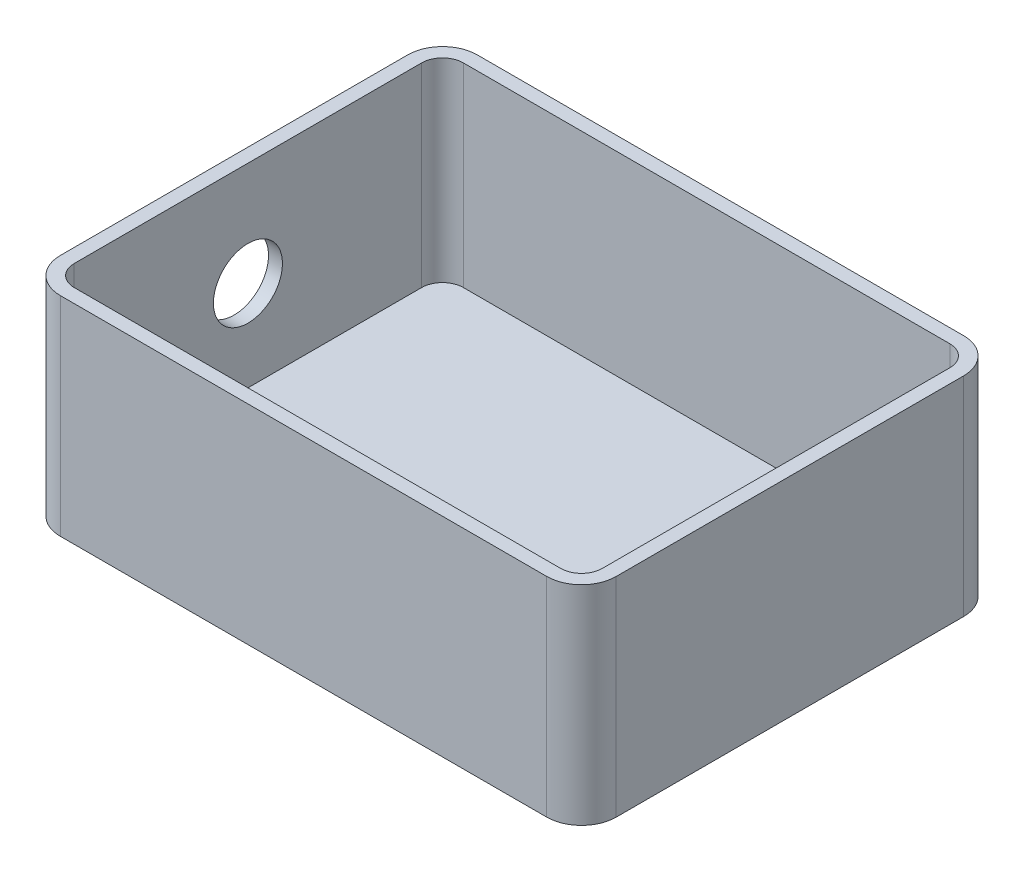
ISO-10303-21;
HEADER;
FILE_DESCRIPTION(('STEP AP214'),'2;1');
FILE_NAME('part.step','',(''),(''),'','','');
FILE_SCHEMA(('AUTOMOTIVE_DESIGN { 1 0 10303 214 1 1 1 1 }'));
ENDSEC;
DATA;
#1=APPLICATION_CONTEXT('core data for automotive mechanical design processes');
#2=APPLICATION_PROTOCOL_DEFINITION('international standard','automotive_design',2000,#1);
#3=PRODUCT_CONTEXT('',#1,'mechanical');
#4=PRODUCT('Part','Part','',(#3));
#5=PRODUCT_RELATED_PRODUCT_CATEGORY('part','',(#4));
#6=PRODUCT_DEFINITION_FORMATION('','',#4);
#7=PRODUCT_DEFINITION_CONTEXT('part definition',#1,'design');
#8=PRODUCT_DEFINITION('design','',#6,#7);
#9=PRODUCT_DEFINITION_SHAPE('','',#8);
#10=(LENGTH_UNIT() NAMED_UNIT(*) SI_UNIT(.MILLI.,.METRE.));
#11=(NAMED_UNIT(*) PLANE_ANGLE_UNIT() SI_UNIT($,.RADIAN.));
#12=(NAMED_UNIT(*) SI_UNIT($,.STERADIAN.) SOLID_ANGLE_UNIT());
#13=UNCERTAINTY_MEASURE_WITH_UNIT(LENGTH_MEASURE(1.E-05),#10,'distance_accuracy_value','');
#14=(GEOMETRIC_REPRESENTATION_CONTEXT(3) GLOBAL_UNCERTAINTY_ASSIGNED_CONTEXT((#13)) GLOBAL_UNIT_ASSIGNED_CONTEXT((#10,
#11,#12)) REPRESENTATION_CONTEXT('',''));
#15=CARTESIAN_POINT('',(0.,0.,0.));
#16=DIRECTION('',(0.,0.,1.));
#17=DIRECTION('',(1.,0.,0.));
#18=AXIS2_PLACEMENT_3D('',#15,#16,#17);
#19=CARTESIAN_POINT('',(50.8,38.1,38.1));
#20=DIRECTION('',(-1.,0.,0.));
#21=DIRECTION('',(0.,0.,1.));
#22=AXIS2_PLACEMENT_3D('',#19,#20,#21);
#23=PLANE('',#22);
#24=DIRECTION('',(0.,0.,-1.));
#25=VECTOR('',#24,1.);
#26=CARTESIAN_POINT('',(50.8,0.,38.1));
#27=LINE('',#26,#25);
#28=CARTESIAN_POINT('',(50.8,0.,31.75));
#29=VERTEX_POINT('',#28);
#30=CARTESIAN_POINT('',(50.8,0.,-31.75));
#31=VERTEX_POINT('',#30);
#32=EDGE_CURVE('E225',#29,#31,#27,.T.);
#33=ORIENTED_EDGE('',*,*,#32,.T.);
#34=DIRECTION('',(0.,-1.,0.));
#35=VECTOR('',#34,1.);
#36=CARTESIAN_POINT('',(50.8,38.1,-31.75));
#37=LINE('',#36,#35);
#38=CARTESIAN_POINT('',(50.8,38.1,-31.75));
#39=VERTEX_POINT('',#38);
#40=EDGE_CURVE('E11',#31,#39,#37,.F.);
#41=ORIENTED_EDGE('',*,*,#40,.T.);
#42=DIRECTION('',(0.,0.,-1.));
#43=VECTOR('',#42,1.);
#44=CARTESIAN_POINT('',(50.8,38.1,38.1));
#45=LINE('',#44,#43);
#46=CARTESIAN_POINT('',(50.8,38.1,31.75));
#47=VERTEX_POINT('',#46);
#48=EDGE_CURVE('E207',#47,#39,#45,.T.);
#49=ORIENTED_EDGE('',*,*,#48,.F.);
#50=DIRECTION('',(0.,-1.,0.));
#51=VECTOR('',#50,1.);
#52=CARTESIAN_POINT('',(50.8,38.1,31.75));
#53=LINE('',#52,#51);
#54=EDGE_CURVE('E47',#47,#29,#53,.T.);
#55=ORIENTED_EDGE('',*,*,#54,.T.);
#56=EDGE_LOOP('',(#33,#41,#49,#55));
#57=FACE_BOUND('',#56,.T.);
#58=ADVANCED_FACE('F41',(#57),#23,.F.);
#59=CARTESIAN_POINT('',(-50.8,38.1,-38.1));
#60=DIRECTION('',(0.,0.,1.));
#61=DIRECTION('',(1.,0.,0.));
#62=AXIS2_PLACEMENT_3D('',#59,#60,#61);
#63=PLANE('',#62);
#64=DIRECTION('',(-1.,0.,0.));
#65=VECTOR('',#64,1.);
#66=CARTESIAN_POINT('',(-50.8,0.,-38.1));
#67=LINE('',#66,#65);
#68=CARTESIAN_POINT('',(44.45,0.,-38.1));
#69=VERTEX_POINT('',#68);
#70=CARTESIAN_POINT('',(-44.45,0.,-38.1));
#71=VERTEX_POINT('',#70);
#72=EDGE_CURVE('E223',#69,#71,#67,.T.);
#73=ORIENTED_EDGE('',*,*,#72,.T.);
#74=DIRECTION('',(0.,-1.,0.));
#75=VECTOR('',#74,1.);
#76=CARTESIAN_POINT('',(-44.45,38.1,-38.1));
#77=LINE('',#76,#75);
#78=CARTESIAN_POINT('',(-44.45,38.1,-38.1));
#79=VERTEX_POINT('',#78);
#80=EDGE_CURVE('E63',#71,#79,#77,.F.);
#81=ORIENTED_EDGE('',*,*,#80,.T.);
#82=DIRECTION('',(-1.,0.,0.));
#83=VECTOR('',#82,1.);
#84=CARTESIAN_POINT('',(-50.8,38.1,-38.1));
#85=LINE('',#84,#83);
#86=CARTESIAN_POINT('',(44.45,38.1,-38.1));
#87=VERTEX_POINT('',#86);
#88=EDGE_CURVE('E215',#87,#79,#85,.T.);
#89=ORIENTED_EDGE('',*,*,#88,.F.);
#90=DIRECTION('',(0.,-1.,0.));
#91=VECTOR('',#90,1.);
#92=CARTESIAN_POINT('',(44.45,38.1,-38.1));
#93=LINE('',#92,#91);
#94=EDGE_CURVE('E256',#87,#69,#93,.T.);
#95=ORIENTED_EDGE('',*,*,#94,.T.);
#96=EDGE_LOOP('',(#73,#81,#89,#95));
#97=FACE_BOUND('',#96,.T.);
#98=ADVANCED_FACE('F280',(#97),#63,.F.);
#99=CARTESIAN_POINT('',(-50.8,38.1,38.1));
#100=DIRECTION('',(1.,0.,0.));
#101=DIRECTION('',(0.,0.,-1.));
#102=AXIS2_PLACEMENT_3D('',#99,#100,#101);
#103=PLANE('',#102);
#104=CARTESIAN_POINT('',(-50.8,19.0854341864919,0.));
#105=DIRECTION('',(-1.,0.,0.));
#106=DIRECTION('',(0.,0.,1.));
#107=AXIS2_PLACEMENT_3D('',#104,#105,#106);
#108=CIRCLE('',#107,6.30728519550272);
#109=CARTESIAN_POINT('',(-50.8,19.0854341864919,6.30728519550272));
#110=VERTEX_POINT('',#109);
#111=EDGE_CURVE('E437',#110,#110,#108,.T.);
#112=ORIENTED_EDGE('',*,*,#111,.F.);
#113=EDGE_LOOP('',(#112));
#114=FACE_BOUND('',#113,.T.);
#115=DIRECTION('',(0.,0.,1.));
#116=VECTOR('',#115,1.);
#117=CARTESIAN_POINT('',(-50.8,0.,38.1));
#118=LINE('',#117,#116);
#119=CARTESIAN_POINT('',(-50.8,0.,-31.75));
#120=VERTEX_POINT('',#119);
#121=CARTESIAN_POINT('',(-50.8,0.,31.75));
#122=VERTEX_POINT('',#121);
#123=EDGE_CURVE('E230',#120,#122,#118,.T.);
#124=ORIENTED_EDGE('',*,*,#123,.T.);
#125=DIRECTION('',(0.,-1.,0.));
#126=VECTOR('',#125,1.);
#127=CARTESIAN_POINT('',(-50.8,38.1,31.75));
#128=LINE('',#127,#126);
#129=CARTESIAN_POINT('',(-50.8,38.1,31.75));
#130=VERTEX_POINT('',#129);
#131=EDGE_CURVE('E246',#122,#130,#128,.F.);
#132=ORIENTED_EDGE('',*,*,#131,.T.);
#133=DIRECTION('',(0.,0.,1.));
#134=VECTOR('',#133,1.);
#135=CARTESIAN_POINT('',(-50.8,38.1,38.1));
#136=LINE('',#135,#134);
#137=CARTESIAN_POINT('',(-50.8,38.1,-31.75));
#138=VERTEX_POINT('',#137);
#139=EDGE_CURVE('E214',#138,#130,#136,.T.);
#140=ORIENTED_EDGE('',*,*,#139,.F.);
#141=DIRECTION('',(0.,-1.,0.));
#142=VECTOR('',#141,1.);
#143=CARTESIAN_POINT('',(-50.8,38.1,-31.75));
#144=LINE('',#143,#142);
#145=EDGE_CURVE('E242',#138,#120,#144,.T.);
#146=ORIENTED_EDGE('',*,*,#145,.T.);
#147=EDGE_LOOP('',(#124,#132,#140,#146));
#148=FACE_BOUND('',#147,.T.);
#149=ADVANCED_FACE('F290',(#114,#148),#103,.F.);
#150=CARTESIAN_POINT('',(-50.8,38.1,38.1));
#151=DIRECTION('',(0.,0.,-1.));
#152=DIRECTION('',(-1.,0.,0.));
#153=AXIS2_PLACEMENT_3D('',#150,#151,#152);
#154=PLANE('',#153);
#155=DIRECTION('',(1.,0.,0.));
#156=VECTOR('',#155,1.);
#157=CARTESIAN_POINT('',(-50.8,38.1,38.1));
#158=LINE('',#157,#156);
#159=CARTESIAN_POINT('',(-44.45,38.1,38.1));
#160=VERTEX_POINT('',#159);
#161=CARTESIAN_POINT('',(44.45,38.1,38.1));
#162=VERTEX_POINT('',#161);
#163=EDGE_CURVE('E217',#160,#162,#158,.T.);
#164=ORIENTED_EDGE('',*,*,#163,.F.);
#165=DIRECTION('',(0.,-1.,0.));
#166=VECTOR('',#165,1.);
#167=CARTESIAN_POINT('',(-44.45,38.1,38.1));
#168=LINE('',#167,#166);
#169=CARTESIAN_POINT('',(-44.45,0.,38.1));
#170=VERTEX_POINT('',#169);
#171=EDGE_CURVE('E232',#160,#170,#168,.T.);
#172=ORIENTED_EDGE('',*,*,#171,.T.);
#173=DIRECTION('',(1.,0.,0.));
#174=VECTOR('',#173,1.);
#175=CARTESIAN_POINT('',(-50.8,0.,38.1));
#176=LINE('',#175,#174);
#177=CARTESIAN_POINT('',(44.45,0.,38.1));
#178=VERTEX_POINT('',#177);
#179=EDGE_CURVE('E213',#170,#178,#176,.T.);
#180=ORIENTED_EDGE('',*,*,#179,.T.);
#181=DIRECTION('',(0.,-1.,0.));
#182=VECTOR('',#181,1.);
#183=CARTESIAN_POINT('',(44.45,38.1,38.1));
#184=LINE('',#183,#182);
#185=EDGE_CURVE('E222',#178,#162,#184,.F.);
#186=ORIENTED_EDGE('',*,*,#185,.T.);
#187=EDGE_LOOP('',(#164,#172,#180,#186));
#188=FACE_BOUND('',#187,.T.);
#189=ADVANCED_FACE('F293',(#188),#154,.F.);
#190=CARTESIAN_POINT('',(0.,38.1,0.));
#191=DIRECTION('',(0.,-1.,0.));
#192=DIRECTION('',(0.,0.,-1.));
#193=AXIS2_PLACEMENT_3D('',#190,#191,#192);
#194=PLANE('',#193);
#195=DIRECTION('',(0.,0.,1.));
#196=VECTOR('',#195,1.);
#197=CARTESIAN_POINT('',(-48.26,38.1,0.));
#198=LINE('',#197,#196);
#199=CARTESIAN_POINT('',(-48.26,38.1,-31.75));
#200=VERTEX_POINT('',#199);
#201=CARTESIAN_POINT('',(-48.26,38.1,31.75));
#202=VERTEX_POINT('',#201);
#203=EDGE_CURVE('E185',#200,#202,#198,.T.);
#204=ORIENTED_EDGE('',*,*,#203,.F.);
#205=CARTESIAN_POINT('',(-44.45,38.1,-31.75));
#206=DIRECTION('',(0.,-1.,0.));
#207=DIRECTION('',(0.,0.,-1.));
#208=AXIS2_PLACEMENT_3D('',#205,#206,#207);
#209=CIRCLE('',#208,3.81);
#210=CARTESIAN_POINT('',(-44.45,38.1,-35.56));
#211=VERTEX_POINT('',#210);
#212=EDGE_CURVE('E199',#211,#200,#209,.F.);
#213=ORIENTED_EDGE('',*,*,#212,.F.);
#214=DIRECTION('',(-1.,0.,0.));
#215=VECTOR('',#214,1.);
#216=CARTESIAN_POINT('',(0.,38.1,-35.56));
#217=LINE('',#216,#215);
#218=CARTESIAN_POINT('',(44.45,38.1,-35.56));
#219=VERTEX_POINT('',#218);
#220=EDGE_CURVE('E57',#219,#211,#217,.T.);
#221=ORIENTED_EDGE('',*,*,#220,.F.);
#222=CARTESIAN_POINT('',(44.45,38.1,-31.75));
#223=DIRECTION('',(0.,-1.,0.));
#224=DIRECTION('',(0.,0.,-1.));
#225=AXIS2_PLACEMENT_3D('',#222,#223,#224);
#226=CIRCLE('',#225,3.81);
#227=CARTESIAN_POINT('',(48.26,38.1,-31.75));
#228=VERTEX_POINT('',#227);
#229=EDGE_CURVE('E189',#228,#219,#226,.F.);
#230=ORIENTED_EDGE('',*,*,#229,.F.);
#231=DIRECTION('',(0.,0.,-1.));
#232=VECTOR('',#231,1.);
#233=CARTESIAN_POINT('',(48.26,38.1,0.));
#234=LINE('',#233,#232);
#235=CARTESIAN_POINT('',(48.26,38.1,31.75));
#236=VERTEX_POINT('',#235);
#237=EDGE_CURVE('E198',#236,#228,#234,.T.);
#238=ORIENTED_EDGE('',*,*,#237,.F.);
#239=CARTESIAN_POINT('',(44.45,38.1,31.75));
#240=DIRECTION('',(0.,-1.,0.));
#241=DIRECTION('',(0.,0.,-1.));
#242=AXIS2_PLACEMENT_3D('',#239,#240,#241);
#243=CIRCLE('',#242,3.81);
#244=CARTESIAN_POINT('',(44.45,38.1,35.56));
#245=VERTEX_POINT('',#244);
#246=EDGE_CURVE('E184',#245,#236,#243,.F.);
#247=ORIENTED_EDGE('',*,*,#246,.F.);
#248=DIRECTION('',(1.,0.,0.));
#249=VECTOR('',#248,1.);
#250=CARTESIAN_POINT('',(0.,38.1,35.56));
#251=LINE('',#250,#249);
#252=CARTESIAN_POINT('',(-44.45,38.1,35.56));
#253=VERTEX_POINT('',#252);
#254=EDGE_CURVE('E194',#253,#245,#251,.T.);
#255=ORIENTED_EDGE('',*,*,#254,.F.);
#256=CARTESIAN_POINT('',(-44.45,38.1,31.75));
#257=DIRECTION('',(0.,-1.,0.));
#258=DIRECTION('',(0.,0.,-1.));
#259=AXIS2_PLACEMENT_3D('',#256,#257,#258);
#260=CIRCLE('',#259,3.81);
#261=EDGE_CURVE('E201',#202,#253,#260,.F.);
#262=ORIENTED_EDGE('',*,*,#261,.F.);
#263=EDGE_LOOP('',(#204,#213,#221,#230,#238,#247,#255,#262));
#264=FACE_BOUND('',#263,.T.);
#265=ORIENTED_EDGE('',*,*,#139,.T.);
#266=CARTESIAN_POINT('',(-44.45,38.1,31.75));
#267=DIRECTION('',(0.,-1.,0.));
#268=DIRECTION('',(0.,0.,-1.));
#269=AXIS2_PLACEMENT_3D('',#266,#267,#268);
#270=CIRCLE('',#269,6.35);
#271=EDGE_CURVE('E258',#130,#160,#270,.F.);
#272=ORIENTED_EDGE('',*,*,#271,.T.);
#273=ORIENTED_EDGE('',*,*,#163,.T.);
#274=CARTESIAN_POINT('',(44.45,38.1,31.75));
#275=DIRECTION('',(0.,-1.,0.));
#276=DIRECTION('',(0.,0.,-1.));
#277=AXIS2_PLACEMENT_3D('',#274,#275,#276);
#278=CIRCLE('',#277,6.35);
#279=EDGE_CURVE('E249',#162,#47,#278,.F.);
#280=ORIENTED_EDGE('',*,*,#279,.T.);
#281=ORIENTED_EDGE('',*,*,#48,.T.);
#282=CARTESIAN_POINT('',(44.45,38.1,-31.75));
#283=DIRECTION('',(0.,-1.,0.));
#284=DIRECTION('',(0.,0.,-1.));
#285=AXIS2_PLACEMENT_3D('',#282,#283,#284);
#286=CIRCLE('',#285,6.35);
#287=EDGE_CURVE('E252',#39,#87,#286,.F.);
#288=ORIENTED_EDGE('',*,*,#287,.T.);
#289=ORIENTED_EDGE('',*,*,#88,.T.);
#290=CARTESIAN_POINT('',(-44.45,38.1,-31.75));
#291=DIRECTION('',(0.,-1.,0.));
#292=DIRECTION('',(0.,0.,-1.));
#293=AXIS2_PLACEMENT_3D('',#290,#291,#292);
#294=CIRCLE('',#293,6.35);
#295=EDGE_CURVE('E255',#79,#138,#294,.F.);
#296=ORIENTED_EDGE('',*,*,#295,.T.);
#297=EDGE_LOOP('',(#265,#272,#273,#280,#281,#288,#289,#296));
#298=FACE_BOUND('',#297,.T.);
#299=ADVANCED_FACE('F278',(#264,#298),#194,.F.);
#300=CARTESIAN_POINT('',(0.,0.,0.));
#301=DIRECTION('',(0.,-1.,0.));
#302=DIRECTION('',(0.,0.,-1.));
#303=AXIS2_PLACEMENT_3D('',#300,#301,#302);
#304=PLANE('',#303);
#305=ORIENTED_EDGE('',*,*,#179,.F.);
#306=CARTESIAN_POINT('',(-44.45,0.,31.75));
#307=DIRECTION('',(0.,-1.,0.));
#308=DIRECTION('',(0.,0.,-1.));
#309=AXIS2_PLACEMENT_3D('',#306,#307,#308);
#310=CIRCLE('',#309,6.35);
#311=EDGE_CURVE('E245',#170,#122,#310,.T.);
#312=ORIENTED_EDGE('',*,*,#311,.T.);
#313=ORIENTED_EDGE('',*,*,#123,.F.);
#314=CARTESIAN_POINT('',(-44.45,0.,-31.75));
#315=DIRECTION('',(0.,-1.,0.));
#316=DIRECTION('',(0.,0.,-1.));
#317=AXIS2_PLACEMENT_3D('',#314,#315,#316);
#318=CIRCLE('',#317,6.35);
#319=EDGE_CURVE('E244',#120,#71,#318,.T.);
#320=ORIENTED_EDGE('',*,*,#319,.T.);
#321=ORIENTED_EDGE('',*,*,#72,.F.);
#322=CARTESIAN_POINT('',(44.45,0.,-31.75));
#323=DIRECTION('',(0.,-1.,0.));
#324=DIRECTION('',(0.,0.,-1.));
#325=AXIS2_PLACEMENT_3D('',#322,#323,#324);
#326=CIRCLE('',#325,6.35);
#327=EDGE_CURVE('E239',#69,#31,#326,.T.);
#328=ORIENTED_EDGE('',*,*,#327,.T.);
#329=ORIENTED_EDGE('',*,*,#32,.F.);
#330=CARTESIAN_POINT('',(44.45,0.,31.75));
#331=DIRECTION('',(0.,-1.,0.));
#332=DIRECTION('',(0.,0.,-1.));
#333=AXIS2_PLACEMENT_3D('',#330,#331,#332);
#334=CIRCLE('',#333,6.35);
#335=EDGE_CURVE('E240',#29,#178,#334,.T.);
#336=ORIENTED_EDGE('',*,*,#335,.T.);
#337=EDGE_LOOP('',(#305,#312,#313,#320,#321,#328,#329,#336));
#338=FACE_BOUND('',#337,.T.);
#339=ADVANCED_FACE('F271',(#338),#304,.T.);
#340=CARTESIAN_POINT('',(-44.45,38.1,31.75));
#341=DIRECTION('',(0.,-1.,0.));
#342=DIRECTION('',(0.,0.,-1.));
#343=AXIS2_PLACEMENT_3D('',#340,#341,#342);
#344=CYLINDRICAL_SURFACE('',#343,6.35);
#345=ORIENTED_EDGE('',*,*,#271,.F.);
#346=ORIENTED_EDGE('',*,*,#131,.F.);
#347=ORIENTED_EDGE('',*,*,#311,.F.);
#348=ORIENTED_EDGE('',*,*,#171,.F.);
#349=EDGE_LOOP('',(#345,#346,#347,#348));
#350=FACE_BOUND('',#349,.T.);
#351=ADVANCED_FACE('F295',(#350),#344,.T.);
#352=CARTESIAN_POINT('',(-44.45,38.1,-31.75));
#353=DIRECTION('',(0.,-1.,0.));
#354=DIRECTION('',(0.,0.,-1.));
#355=AXIS2_PLACEMENT_3D('',#352,#353,#354);
#356=CYLINDRICAL_SURFACE('',#355,6.35);
#357=ORIENTED_EDGE('',*,*,#295,.F.);
#358=ORIENTED_EDGE('',*,*,#80,.F.);
#359=ORIENTED_EDGE('',*,*,#319,.F.);
#360=ORIENTED_EDGE('',*,*,#145,.F.);
#361=EDGE_LOOP('',(#357,#358,#359,#360));
#362=FACE_BOUND('',#361,.T.);
#363=ADVANCED_FACE('F283',(#362),#356,.T.);
#364=CARTESIAN_POINT('',(44.45,38.1,-31.75));
#365=DIRECTION('',(0.,-1.,0.));
#366=DIRECTION('',(0.,0.,-1.));
#367=AXIS2_PLACEMENT_3D('',#364,#365,#366);
#368=CYLINDRICAL_SURFACE('',#367,6.35);
#369=ORIENTED_EDGE('',*,*,#287,.F.);
#370=ORIENTED_EDGE('',*,*,#40,.F.);
#371=ORIENTED_EDGE('',*,*,#327,.F.);
#372=ORIENTED_EDGE('',*,*,#94,.F.);
#373=EDGE_LOOP('',(#369,#370,#371,#372));
#374=FACE_BOUND('',#373,.T.);
#375=ADVANCED_FACE('F277',(#374),#368,.T.);
#376=CARTESIAN_POINT('',(44.45,38.1,31.75));
#377=DIRECTION('',(0.,-1.,0.));
#378=DIRECTION('',(0.,0.,-1.));
#379=AXIS2_PLACEMENT_3D('',#376,#377,#378);
#380=CYLINDRICAL_SURFACE('',#379,6.35);
#381=ORIENTED_EDGE('',*,*,#279,.F.);
#382=ORIENTED_EDGE('',*,*,#185,.F.);
#383=ORIENTED_EDGE('',*,*,#335,.F.);
#384=ORIENTED_EDGE('',*,*,#54,.F.);
#385=EDGE_LOOP('',(#381,#382,#383,#384));
#386=FACE_BOUND('',#385,.T.);
#387=ADVANCED_FACE('F43',(#386),#380,.T.);
#388=CARTESIAN_POINT('',(48.26,38.1,38.1));
#389=DIRECTION('',(-1.,0.,0.));
#390=DIRECTION('',(0.,0.,1.));
#391=AXIS2_PLACEMENT_3D('',#388,#389,#390);
#392=PLANE('',#391);
#393=DIRECTION('',(0.,0.,-1.));
#394=VECTOR('',#393,1.);
#395=CARTESIAN_POINT('',(48.26,2.54,0.));
#396=LINE('',#395,#394);
#397=CARTESIAN_POINT('',(48.26,2.54,31.75));
#398=VERTEX_POINT('',#397);
#399=CARTESIAN_POINT('',(48.26,2.54,-31.75));
#400=VERTEX_POINT('',#399);
#401=EDGE_CURVE('E438',#398,#400,#396,.T.);
#402=ORIENTED_EDGE('',*,*,#401,.F.);
#403=DIRECTION('',(0.,1.,0.));
#404=VECTOR('',#403,1.);
#405=CARTESIAN_POINT('',(48.26,38.1,31.75));
#406=LINE('',#405,#404);
#407=EDGE_CURVE('E450',#236,#398,#406,.F.);
#408=ORIENTED_EDGE('',*,*,#407,.F.);
#409=ORIENTED_EDGE('',*,*,#237,.T.);
#410=DIRECTION('',(0.,1.,0.));
#411=VECTOR('',#410,1.);
#412=CARTESIAN_POINT('',(48.26,38.1,-31.75));
#413=LINE('',#412,#411);
#414=EDGE_CURVE('E229',#400,#228,#413,.T.);
#415=ORIENTED_EDGE('',*,*,#414,.F.);
#416=EDGE_LOOP('',(#402,#408,#409,#415));
#417=FACE_BOUND('',#416,.T.);
#418=ADVANCED_FACE('F300',(#417),#392,.T.);
#419=CARTESIAN_POINT('',(-50.8,38.1,-35.56));
#420=DIRECTION('',(0.,0.,1.));
#421=DIRECTION('',(1.,0.,0.));
#422=AXIS2_PLACEMENT_3D('',#419,#420,#421);
#423=PLANE('',#422);
#424=DIRECTION('',(-1.,0.,0.));
#425=VECTOR('',#424,1.);
#426=CARTESIAN_POINT('',(0.,2.54,-35.56));
#427=LINE('',#426,#425);
#428=CARTESIAN_POINT('',(44.45,2.54,-35.56));
#429=VERTEX_POINT('',#428);
#430=CARTESIAN_POINT('',(-44.45,2.54,-35.56));
#431=VERTEX_POINT('',#430);
#432=EDGE_CURVE('E176',#429,#431,#427,.T.);
#433=ORIENTED_EDGE('',*,*,#432,.F.);
#434=DIRECTION('',(0.,1.,0.));
#435=VECTOR('',#434,1.);
#436=CARTESIAN_POINT('',(44.45,38.1,-35.56));
#437=LINE('',#436,#435);
#438=EDGE_CURVE('E206',#219,#429,#437,.F.);
#439=ORIENTED_EDGE('',*,*,#438,.F.);
#440=ORIENTED_EDGE('',*,*,#220,.T.);
#441=DIRECTION('',(0.,1.,0.));
#442=VECTOR('',#441,1.);
#443=CARTESIAN_POINT('',(-44.45,38.1,-35.56));
#444=LINE('',#443,#442);
#445=EDGE_CURVE('E453',#431,#211,#444,.T.);
#446=ORIENTED_EDGE('',*,*,#445,.F.);
#447=EDGE_LOOP('',(#433,#439,#440,#446));
#448=FACE_BOUND('',#447,.T.);
#449=ADVANCED_FACE('F302',(#448),#423,.T.);
#450=CARTESIAN_POINT('',(-48.26,38.1,38.1));
#451=DIRECTION('',(1.,0.,0.));
#452=DIRECTION('',(0.,0.,-1.));
#453=AXIS2_PLACEMENT_3D('',#450,#451,#452);
#454=PLANE('',#453);
#455=CARTESIAN_POINT('',(-48.26,19.0854341864919,0.));
#456=DIRECTION('',(1.,0.,0.));
#457=DIRECTION('',(0.,0.,-1.));
#458=AXIS2_PLACEMENT_3D('',#455,#456,#457);
#459=CIRCLE('',#458,6.30728519550272);
#460=CARTESIAN_POINT('',(-48.26,19.0854341864919,-6.30728519550272));
#461=VERTEX_POINT('',#460);
#462=EDGE_CURVE('E439',#461,#461,#459,.F.);
#463=ORIENTED_EDGE('',*,*,#462,.T.);
#464=EDGE_LOOP('',(#463));
#465=FACE_BOUND('',#464,.T.);
#466=DIRECTION('',(0.,0.,1.));
#467=VECTOR('',#466,1.);
#468=CARTESIAN_POINT('',(-48.26,2.54,0.));
#469=LINE('',#468,#467);
#470=CARTESIAN_POINT('',(-48.26,2.54,-31.75));
#471=VERTEX_POINT('',#470);
#472=CARTESIAN_POINT('',(-48.26,2.54,31.75));
#473=VERTEX_POINT('',#472);
#474=EDGE_CURVE('E174',#471,#473,#469,.T.);
#475=ORIENTED_EDGE('',*,*,#474,.F.);
#476=DIRECTION('',(0.,1.,0.));
#477=VECTOR('',#476,1.);
#478=CARTESIAN_POINT('',(-48.26,38.1,-31.75));
#479=LINE('',#478,#477);
#480=EDGE_CURVE('E170',#200,#471,#479,.F.);
#481=ORIENTED_EDGE('',*,*,#480,.F.);
#482=ORIENTED_EDGE('',*,*,#203,.T.);
#483=DIRECTION('',(0.,1.,0.));
#484=VECTOR('',#483,1.);
#485=CARTESIAN_POINT('',(-48.26,38.1,31.75));
#486=LINE('',#485,#484);
#487=EDGE_CURVE('E159',#473,#202,#486,.T.);
#488=ORIENTED_EDGE('',*,*,#487,.F.);
#489=EDGE_LOOP('',(#475,#481,#482,#488));
#490=FACE_BOUND('',#489,.T.);
#491=ADVANCED_FACE('F179',(#465,#490),#454,.T.);
#492=CARTESIAN_POINT('',(-50.8,38.1,35.56));
#493=DIRECTION('',(0.,0.,-1.));
#494=DIRECTION('',(-1.,0.,0.));
#495=AXIS2_PLACEMENT_3D('',#492,#493,#494);
#496=PLANE('',#495);
#497=ORIENTED_EDGE('',*,*,#254,.T.);
#498=DIRECTION('',(0.,1.,0.));
#499=VECTOR('',#498,1.);
#500=CARTESIAN_POINT('',(44.45,38.1,35.56));
#501=LINE('',#500,#499);
#502=CARTESIAN_POINT('',(44.45,2.54,35.56));
#503=VERTEX_POINT('',#502);
#504=EDGE_CURVE('E191',#503,#245,#501,.T.);
#505=ORIENTED_EDGE('',*,*,#504,.F.);
#506=DIRECTION('',(1.,0.,0.));
#507=VECTOR('',#506,1.);
#508=CARTESIAN_POINT('',(0.,2.54,35.56));
#509=LINE('',#508,#507);
#510=CARTESIAN_POINT('',(-44.45,2.54,35.56));
#511=VERTEX_POINT('',#510);
#512=EDGE_CURVE('E180',#511,#503,#509,.T.);
#513=ORIENTED_EDGE('',*,*,#512,.F.);
#514=DIRECTION('',(0.,1.,0.));
#515=VECTOR('',#514,1.);
#516=CARTESIAN_POINT('',(-44.45,38.1,35.56));
#517=LINE('',#516,#515);
#518=EDGE_CURVE('E162',#253,#511,#517,.F.);
#519=ORIENTED_EDGE('',*,*,#518,.F.);
#520=EDGE_LOOP('',(#497,#505,#513,#519));
#521=FACE_BOUND('',#520,.T.);
#522=ADVANCED_FACE('F360',(#521),#496,.T.);
#523=CARTESIAN_POINT('',(0.,2.54,0.));
#524=DIRECTION('',(0.,-1.,0.));
#525=DIRECTION('',(0.,0.,-1.));
#526=AXIS2_PLACEMENT_3D('',#523,#524,#525);
#527=PLANE('',#526);
#528=ORIENTED_EDGE('',*,*,#512,.T.);
#529=CARTESIAN_POINT('',(44.45,2.54,31.75));
#530=DIRECTION('',(0.,-1.,0.));
#531=DIRECTION('',(0.,0.,-1.));
#532=AXIS2_PLACEMENT_3D('',#529,#530,#531);
#533=CIRCLE('',#532,3.81);
#534=EDGE_CURVE('E195',#398,#503,#533,.T.);
#535=ORIENTED_EDGE('',*,*,#534,.F.);
#536=ORIENTED_EDGE('',*,*,#401,.T.);
#537=CARTESIAN_POINT('',(44.45,2.54,-31.75));
#538=DIRECTION('',(0.,-1.,0.));
#539=DIRECTION('',(0.,0.,-1.));
#540=AXIS2_PLACEMENT_3D('',#537,#538,#539);
#541=CIRCLE('',#540,3.81);
#542=EDGE_CURVE('E452',#429,#400,#541,.T.);
#543=ORIENTED_EDGE('',*,*,#542,.F.);
#544=ORIENTED_EDGE('',*,*,#432,.T.);
#545=CARTESIAN_POINT('',(-44.45,2.54,-31.75));
#546=DIRECTION('',(0.,-1.,0.));
#547=DIRECTION('',(0.,0.,-1.));
#548=AXIS2_PLACEMENT_3D('',#545,#546,#547);
#549=CIRCLE('',#548,3.81);
#550=EDGE_CURVE('E169',#471,#431,#549,.T.);
#551=ORIENTED_EDGE('',*,*,#550,.F.);
#552=ORIENTED_EDGE('',*,*,#474,.T.);
#553=CARTESIAN_POINT('',(-44.45,2.54,31.75));
#554=DIRECTION('',(0.,-1.,0.));
#555=DIRECTION('',(0.,0.,-1.));
#556=AXIS2_PLACEMENT_3D('',#553,#554,#555);
#557=CIRCLE('',#556,3.81);
#558=EDGE_CURVE('E156',#511,#473,#557,.T.);
#559=ORIENTED_EDGE('',*,*,#558,.F.);
#560=EDGE_LOOP('',(#528,#535,#536,#543,#544,#551,#552,#559));
#561=FACE_BOUND('',#560,.T.);
#562=ADVANCED_FACE('F171',(#561),#527,.F.);
#563=CARTESIAN_POINT('',(-44.45,38.1,31.75));
#564=DIRECTION('',(0.,-1.,0.));
#565=DIRECTION('',(0.,0.,-1.));
#566=AXIS2_PLACEMENT_3D('',#563,#564,#565);
#567=CYLINDRICAL_SURFACE('',#566,3.81);
#568=ORIENTED_EDGE('',*,*,#261,.T.);
#569=ORIENTED_EDGE('',*,*,#518,.T.);
#570=ORIENTED_EDGE('',*,*,#558,.T.);
#571=ORIENTED_EDGE('',*,*,#487,.T.);
#572=EDGE_LOOP('',(#568,#569,#570,#571));
#573=FACE_BOUND('',#572,.T.);
#574=ADVANCED_FACE('F158',(#573),#567,.F.);
#575=CARTESIAN_POINT('',(-44.45,38.1,-31.75));
#576=DIRECTION('',(0.,-1.,0.));
#577=DIRECTION('',(0.,0.,-1.));
#578=AXIS2_PLACEMENT_3D('',#575,#576,#577);
#579=CYLINDRICAL_SURFACE('',#578,3.81);
#580=ORIENTED_EDGE('',*,*,#212,.T.);
#581=ORIENTED_EDGE('',*,*,#480,.T.);
#582=ORIENTED_EDGE('',*,*,#550,.T.);
#583=ORIENTED_EDGE('',*,*,#445,.T.);
#584=EDGE_LOOP('',(#580,#581,#582,#583));
#585=FACE_BOUND('',#584,.T.);
#586=ADVANCED_FACE('F384',(#585),#579,.F.);
#587=CARTESIAN_POINT('',(44.45,38.1,-31.75));
#588=DIRECTION('',(0.,-1.,0.));
#589=DIRECTION('',(0.,0.,-1.));
#590=AXIS2_PLACEMENT_3D('',#587,#588,#589);
#591=CYLINDRICAL_SURFACE('',#590,3.81);
#592=ORIENTED_EDGE('',*,*,#229,.T.);
#593=ORIENTED_EDGE('',*,*,#438,.T.);
#594=ORIENTED_EDGE('',*,*,#542,.T.);
#595=ORIENTED_EDGE('',*,*,#414,.T.);
#596=EDGE_LOOP('',(#592,#593,#594,#595));
#597=FACE_BOUND('',#596,.T.);
#598=ADVANCED_FACE('F393',(#597),#591,.F.);
#599=CARTESIAN_POINT('',(44.45,38.1,31.75));
#600=DIRECTION('',(0.,-1.,0.));
#601=DIRECTION('',(0.,0.,-1.));
#602=AXIS2_PLACEMENT_3D('',#599,#600,#601);
#603=CYLINDRICAL_SURFACE('',#602,3.81);
#604=ORIENTED_EDGE('',*,*,#246,.T.);
#605=ORIENTED_EDGE('',*,*,#407,.T.);
#606=ORIENTED_EDGE('',*,*,#534,.T.);
#607=ORIENTED_EDGE('',*,*,#504,.T.);
#608=EDGE_LOOP('',(#604,#605,#606,#607));
#609=FACE_BOUND('',#608,.T.);
#610=ADVANCED_FACE('F404',(#609),#603,.F.);
#611=CARTESIAN_POINT('',(50.801,19.0854341864919,0.));
#612=DIRECTION('',(-1.,0.,0.));
#613=DIRECTION('',(0.,0.,1.));
#614=AXIS2_PLACEMENT_3D('',#611,#612,#613);
#615=CYLINDRICAL_SURFACE('',#614,6.30728519550272);
#616=ORIENTED_EDGE('',*,*,#462,.F.);
#617=EDGE_LOOP('',(#616));
#618=FACE_BOUND('',#617,.T.);
#619=ORIENTED_EDGE('',*,*,#111,.T.);
#620=EDGE_LOOP('',(#619));
#621=FACE_BOUND('',#620,.T.);
#622=ADVANCED_FACE('F412',(#618,#621),#615,.F.);
#623=CLOSED_SHELL('',(#58,#98,#149,#189,#299,#339,#351,#363,#375,#387,#418,#449,#491,#522,#562,
#574,#586,#598,#610,#622));
#624=MANIFOLD_SOLID_BREP('B2',#623);
#625=ADVANCED_BREP_SHAPE_REPRESENTATION('',(#18,#624),#14);
#626=SHAPE_DEFINITION_REPRESENTATION(#9,#625);
ENDSEC;
END-ISO-10303-21;
